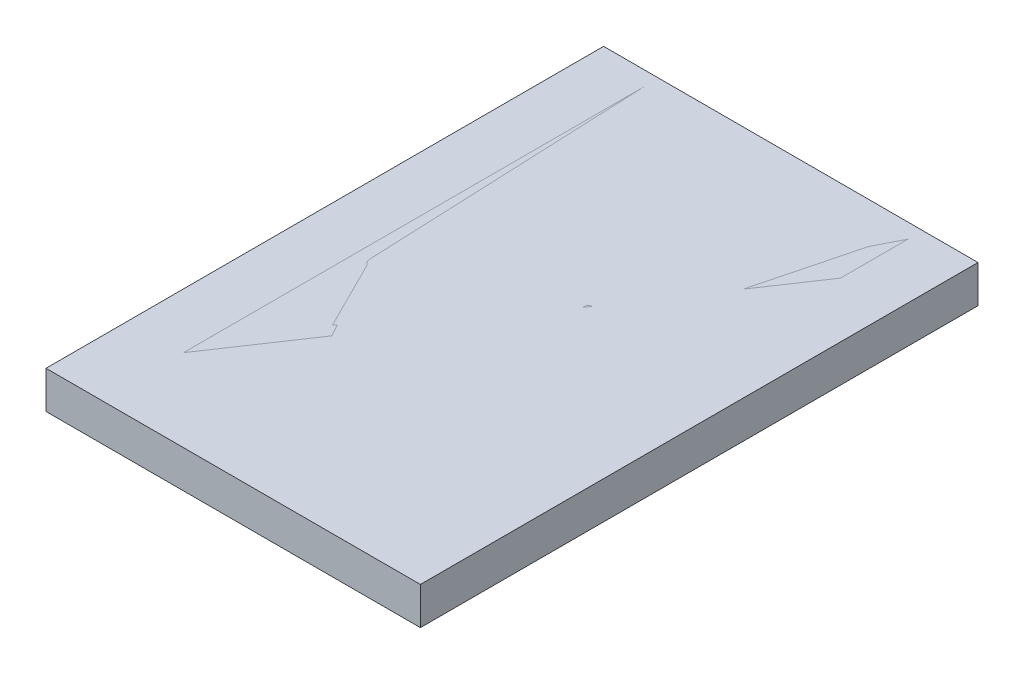
ISO-10303-21;
HEADER;
FILE_DESCRIPTION(('STEP AP214'),'2;1');
FILE_NAME('part.step','',(''),(''),'','','');
FILE_SCHEMA(('AUTOMOTIVE_DESIGN { 1 0 10303 214 1 1 1 1 }'));
ENDSEC;
DATA;
#1=APPLICATION_CONTEXT('core data for automotive mechanical design processes');
#2=APPLICATION_PROTOCOL_DEFINITION('international standard','automotive_design',2000,#1);
#3=PRODUCT_CONTEXT('',#1,'mechanical');
#4=PRODUCT('Part','Part','',(#3));
#5=PRODUCT_RELATED_PRODUCT_CATEGORY('part','',(#4));
#6=PRODUCT_DEFINITION_FORMATION('','',#4);
#7=PRODUCT_DEFINITION_CONTEXT('part definition',#1,'design');
#8=PRODUCT_DEFINITION('design','',#6,#7);
#9=PRODUCT_DEFINITION_SHAPE('','',#8);
#10=(LENGTH_UNIT() NAMED_UNIT(*) SI_UNIT(.MILLI.,.METRE.));
#11=(NAMED_UNIT(*) PLANE_ANGLE_UNIT() SI_UNIT($,.RADIAN.));
#12=(NAMED_UNIT(*) SI_UNIT($,.STERADIAN.) SOLID_ANGLE_UNIT());
#13=UNCERTAINTY_MEASURE_WITH_UNIT(LENGTH_MEASURE(1.E-05),#10,'distance_accuracy_value','');
#14=(GEOMETRIC_REPRESENTATION_CONTEXT(3) GLOBAL_UNCERTAINTY_ASSIGNED_CONTEXT((#13)) GLOBAL_UNIT_ASSIGNED_CONTEXT((#10,
#11,#12)) REPRESENTATION_CONTEXT('',''));
#15=CARTESIAN_POINT('',(0.,0.,0.));
#16=DIRECTION('',(0.,0.,1.));
#17=DIRECTION('',(1.,0.,0.));
#18=AXIS2_PLACEMENT_3D('',#15,#16,#17);
#19=CARTESIAN_POINT('',(68.2,0.,-3.17499999999998));
#20=DIRECTION('',(1.,0.,0.));
#21=DIRECTION('',(0.,0.,-1.));
#22=AXIS2_PLACEMENT_3D('',#19,#20,#21);
#23=PLANE('',#22);
#24=DIRECTION('',(0.,0.,-1.));
#25=VECTOR('',#24,1.);
#26=CARTESIAN_POINT('',(68.2,8.,-3.17499999999998));
#27=LINE('',#26,#25);
#28=CARTESIAN_POINT('',(68.2,8.,115.975));
#29=VERTEX_POINT('',#28);
#30=CARTESIAN_POINT('',(68.2,8.,-3.17499999999998));
#31=VERTEX_POINT('',#30);
#32=EDGE_CURVE('E111',#29,#31,#27,.T.);
#33=ORIENTED_EDGE('',*,*,#32,.F.);
#34=DIRECTION('',(0.,1.,0.));
#35=VECTOR('',#34,1.);
#36=CARTESIAN_POINT('',(68.2,0.,115.975));
#37=LINE('',#36,#35);
#38=CARTESIAN_POINT('',(68.2,0.,115.975));
#39=VERTEX_POINT('',#38);
#40=EDGE_CURVE('E12',#39,#29,#37,.T.);
#41=ORIENTED_EDGE('',*,*,#40,.F.);
#42=DIRECTION('',(0.,0.,-1.));
#43=VECTOR('',#42,1.);
#44=CARTESIAN_POINT('',(68.2,0.,-3.17499999999998));
#45=LINE('',#44,#43);
#46=CARTESIAN_POINT('',(68.2,0.,-3.17499999999998));
#47=VERTEX_POINT('',#46);
#48=EDGE_CURVE('E105',#39,#47,#45,.T.);
#49=ORIENTED_EDGE('',*,*,#48,.T.);
#50=DIRECTION('',(0.,1.,0.));
#51=VECTOR('',#50,1.);
#52=CARTESIAN_POINT('',(68.2,0.,-3.17499999999998));
#53=LINE('',#52,#51);
#54=EDGE_CURVE('E50',#47,#31,#53,.T.);
#55=ORIENTED_EDGE('',*,*,#54,.T.);
#56=EDGE_LOOP('',(#33,#41,#49,#55));
#57=FACE_BOUND('',#56,.T.);
#58=ADVANCED_FACE('F47',(#57),#23,.T.);
#59=CARTESIAN_POINT('',(-11.8,0.,115.975));
#60=DIRECTION('',(0.,0.,1.));
#61=DIRECTION('',(1.,0.,0.));
#62=AXIS2_PLACEMENT_3D('',#59,#60,#61);
#63=PLANE('',#62);
#64=DIRECTION('',(1.,0.,0.));
#65=VECTOR('',#64,1.);
#66=CARTESIAN_POINT('',(-11.8,8.,115.975));
#67=LINE('',#66,#65);
#68=CARTESIAN_POINT('',(-11.8,8.,115.975));
#69=VERTEX_POINT('',#68);
#70=EDGE_CURVE('E107',#69,#29,#67,.T.);
#71=ORIENTED_EDGE('',*,*,#70,.F.);
#72=DIRECTION('',(0.,1.,0.));
#73=VECTOR('',#72,1.);
#74=CARTESIAN_POINT('',(-11.8,0.,115.975));
#75=LINE('',#74,#73);
#76=CARTESIAN_POINT('',(-11.8,0.,115.975));
#77=VERTEX_POINT('',#76);
#78=EDGE_CURVE('E56',#77,#69,#75,.T.);
#79=ORIENTED_EDGE('',*,*,#78,.F.);
#80=DIRECTION('',(1.,0.,0.));
#81=VECTOR('',#80,1.);
#82=CARTESIAN_POINT('',(-11.8,0.,115.975));
#83=LINE('',#82,#81);
#84=EDGE_CURVE('E102',#77,#39,#83,.T.);
#85=ORIENTED_EDGE('',*,*,#84,.T.);
#86=ORIENTED_EDGE('',*,*,#40,.T.);
#87=EDGE_LOOP('',(#71,#79,#85,#86));
#88=FACE_BOUND('',#87,.T.);
#89=ADVANCED_FACE('F121',(#88),#63,.T.);
#90=CARTESIAN_POINT('',(-11.8,0.,-3.17499999999998));
#91=DIRECTION('',(-1.,0.,0.));
#92=DIRECTION('',(0.,0.,1.));
#93=AXIS2_PLACEMENT_3D('',#90,#91,#92);
#94=PLANE('',#93);
#95=DIRECTION('',(0.,0.,1.));
#96=VECTOR('',#95,1.);
#97=CARTESIAN_POINT('',(-11.8,8.,-3.17499999999998));
#98=LINE('',#97,#96);
#99=CARTESIAN_POINT('',(-11.8,8.,-3.17499999999998));
#100=VERTEX_POINT('',#99);
#101=EDGE_CURVE('E97',#100,#69,#98,.T.);
#102=ORIENTED_EDGE('',*,*,#101,.F.);
#103=DIRECTION('',(0.,1.,0.));
#104=VECTOR('',#103,1.);
#105=CARTESIAN_POINT('',(-11.8,0.,-3.17499999999998));
#106=LINE('',#105,#104);
#107=CARTESIAN_POINT('',(-11.8,0.,-3.17499999999998));
#108=VERTEX_POINT('',#107);
#109=EDGE_CURVE('E92',#108,#100,#106,.T.);
#110=ORIENTED_EDGE('',*,*,#109,.F.);
#111=DIRECTION('',(0.,0.,1.));
#112=VECTOR('',#111,1.);
#113=CARTESIAN_POINT('',(-11.8,0.,-3.17499999999998));
#114=LINE('',#113,#112);
#115=EDGE_CURVE('E95',#108,#77,#114,.T.);
#116=ORIENTED_EDGE('',*,*,#115,.T.);
#117=ORIENTED_EDGE('',*,*,#78,.T.);
#118=EDGE_LOOP('',(#102,#110,#116,#117));
#119=FACE_BOUND('',#118,.T.);
#120=ADVANCED_FACE('F94',(#119),#94,.T.);
#121=CARTESIAN_POINT('',(-11.8,0.,-3.17499999999998));
#122=DIRECTION('',(0.,0.,-1.));
#123=DIRECTION('',(-1.,0.,0.));
#124=AXIS2_PLACEMENT_3D('',#121,#122,#123);
#125=PLANE('',#124);
#126=DIRECTION('',(-1.,0.,0.));
#127=VECTOR('',#126,1.);
#128=CARTESIAN_POINT('',(-11.8,8.,-3.17499999999998));
#129=LINE('',#128,#127);
#130=EDGE_CURVE('E114',#31,#100,#129,.T.);
#131=ORIENTED_EDGE('',*,*,#130,.F.);
#132=ORIENTED_EDGE('',*,*,#54,.F.);
#133=DIRECTION('',(-1.,0.,0.));
#134=VECTOR('',#133,1.);
#135=CARTESIAN_POINT('',(-11.8,0.,-3.17499999999998));
#136=LINE('',#135,#134);
#137=EDGE_CURVE('E101',#47,#108,#136,.T.);
#138=ORIENTED_EDGE('',*,*,#137,.T.);
#139=ORIENTED_EDGE('',*,*,#109,.T.);
#140=EDGE_LOOP('',(#131,#132,#138,#139));
#141=FACE_BOUND('',#140,.T.);
#142=ADVANCED_FACE('F104',(#141),#125,.T.);
#143=CARTESIAN_POINT('',(0.,0.,0.));
#144=DIRECTION('',(0.,1.,0.));
#145=DIRECTION('',(0.,0.,1.));
#146=AXIS2_PLACEMENT_3D('',#143,#144,#145);
#147=PLANE('',#146);
#148=ORIENTED_EDGE('',*,*,#48,.F.);
#149=ORIENTED_EDGE('',*,*,#84,.F.);
#150=ORIENTED_EDGE('',*,*,#115,.F.);
#151=ORIENTED_EDGE('',*,*,#137,.F.);
#152=EDGE_LOOP('',(#148,#149,#150,#151));
#153=FACE_BOUND('',#152,.T.);
#154=ADVANCED_FACE('F100',(#153),#147,.F.);
#155=CARTESIAN_POINT('',(0.,8.,0.));
#156=DIRECTION('',(0.,1.,0.));
#157=DIRECTION('',(0.,0.,1.));
#158=AXIS2_PLACEMENT_3D('',#155,#156,#157);
#159=PLANE('',#158);
#160=ORIENTED_EDGE('',*,*,#32,.T.);
#161=ORIENTED_EDGE('',*,*,#130,.T.);
#162=ORIENTED_EDGE('',*,*,#101,.T.);
#163=ORIENTED_EDGE('',*,*,#70,.T.);
#164=EDGE_LOOP('',(#160,#161,#162,#163));
#165=FACE_BOUND('',#164,.T.);
#166=ADVANCED_FACE('F120',(#165),#159,.T.);
#167=CLOSED_SHELL('',(#58,#89,#120,#142,#154,#166));
#168=MANIFOLD_SOLID_BREP('B2_NOT_SHOWN',#167);
#169=CARTESIAN_POINT('',(0.,8.,0.));
#170=DIRECTION('',(0.,1.,0.));
#171=DIRECTION('',(0.,0.,1.));
#172=AXIS2_PLACEMENT_3D('',#169,#170,#171);
#173=PLANE('',#172);
#174=CARTESIAN_POINT('',(51.82,8.,60.98));
#175=DIRECTION('',(0.,-1.,0.));
#176=DIRECTION('',(0.,0.,-1.));
#177=AXIS2_PLACEMENT_3D('',#174,#175,#176);
#178=CIRCLE('',#177,2.);
#179=CARTESIAN_POINT('',(51.82,8.,58.98));
#180=VERTEX_POINT('',#179);
#181=EDGE_CURVE('E277',#180,#180,#178,.T.);
#182=ORIENTED_EDGE('',*,*,#181,.T.);
#183=EDGE_LOOP('',(#182));
#184=FACE_BOUND('',#183,.T.);
#185=CARTESIAN_POINT('',(4.58,8.,108.22));
#186=DIRECTION('',(0.,-1.,0.));
#187=DIRECTION('',(0.,0.,-1.));
#188=AXIS2_PLACEMENT_3D('',#185,#186,#187);
#189=CIRCLE('',#188,2.);
#190=CARTESIAN_POINT('',(4.58,8.,106.22));
#191=VERTEX_POINT('',#190);
#192=EDGE_CURVE('E289',#191,#191,#189,.T.);
#193=ORIENTED_EDGE('',*,*,#192,.T.);
#194=EDGE_LOOP('',(#193));
#195=FACE_BOUND('',#194,.T.);
#196=CARTESIAN_POINT('',(28.2,8.,84.6));
#197=DIRECTION('',(0.,1.,0.));
#198=DIRECTION('',(0.,0.,1.));
#199=AXIS2_PLACEMENT_3D('',#196,#197,#198);
#200=CIRCLE('',#199,14.);
#201=CARTESIAN_POINT('',(28.2,8.,98.6));
#202=VERTEX_POINT('',#201);
#203=EDGE_CURVE('E295',#202,#202,#200,.T.);
#204=ORIENTED_EDGE('',*,*,#203,.F.);
#205=EDGE_LOOP('',(#204));
#206=FACE_BOUND('',#205,.T.);
#207=CARTESIAN_POINT('',(4.58,8.,51.82));
#208=DIRECTION('',(0.,1.,0.));
#209=DIRECTION('',(0.,0.,-1.));
#210=AXIS2_PLACEMENT_3D('',#207,#208,#209);
#211=CIRCLE('',#210,2.);
#212=CARTESIAN_POINT('',(4.58,8.,49.82));
#213=VERTEX_POINT('',#212);
#214=EDGE_CURVE('E301',#213,#213,#211,.T.);
#215=ORIENTED_EDGE('',*,*,#214,.F.);
#216=EDGE_LOOP('',(#215));
#217=FACE_BOUND('',#216,.T.);
#218=CARTESIAN_POINT('',(51.82,8.,51.82));
#219=DIRECTION('',(0.,1.,0.));
#220=DIRECTION('',(0.,0.,1.));
#221=AXIS2_PLACEMENT_3D('',#218,#219,#220);
#222=CIRCLE('',#221,2.);
#223=CARTESIAN_POINT('',(51.82,8.,53.82));
#224=VERTEX_POINT('',#223);
#225=EDGE_CURVE('E307',#224,#224,#222,.T.);
#226=ORIENTED_EDGE('',*,*,#225,.F.);
#227=EDGE_LOOP('',(#226));
#228=FACE_BOUND('',#227,.T.);
#229=CARTESIAN_POINT('',(51.82,8.,4.58));
#230=DIRECTION('',(0.,1.,0.));
#231=DIRECTION('',(0.,0.,-1.));
#232=AXIS2_PLACEMENT_3D('',#229,#230,#231);
#233=CIRCLE('',#232,2.);
#234=CARTESIAN_POINT('',(51.82,8.,2.57999999999999));
#235=VERTEX_POINT('',#234);
#236=EDGE_CURVE('E313',#235,#235,#233,.T.);
#237=ORIENTED_EDGE('',*,*,#236,.F.);
#238=EDGE_LOOP('',(#237));
#239=FACE_BOUND('',#238,.T.);
#240=CARTESIAN_POINT('',(4.58,8.,4.58));
#241=DIRECTION('',(0.,1.,0.));
#242=DIRECTION('',(0.,0.,1.));
#243=AXIS2_PLACEMENT_3D('',#240,#241,#242);
#244=CIRCLE('',#243,2.);
#245=CARTESIAN_POINT('',(4.58,8.,6.58));
#246=VERTEX_POINT('',#245);
#247=EDGE_CURVE('E319',#246,#246,#244,.T.);
#248=ORIENTED_EDGE('',*,*,#247,.F.);
#249=EDGE_LOOP('',(#248));
#250=FACE_BOUND('',#249,.T.);
#251=CARTESIAN_POINT('',(28.2,8.,28.2));
#252=DIRECTION('',(0.,1.,0.));
#253=DIRECTION('',(0.,0.,1.));
#254=AXIS2_PLACEMENT_3D('',#251,#252,#253);
#255=CIRCLE('',#254,19.25);
#256=CARTESIAN_POINT('',(28.2,8.,47.45));
#257=VERTEX_POINT('',#256);
#258=EDGE_CURVE('E331',#257,#257,#255,.T.);
#259=ORIENTED_EDGE('',*,*,#258,.F.);
#260=EDGE_LOOP('',(#259));
#261=FACE_BOUND('',#260,.T.);
#262=DIRECTION('',(0.,0.,1.));
#263=VECTOR('',#262,1.);
#264=CARTESIAN_POINT('',(0.,8.,0.));
#265=LINE('',#264,#263);
#266=CARTESIAN_POINT('',(0.,8.,0.));
#267=VERTEX_POINT('',#266);
#268=CARTESIAN_POINT('',(0.,8.,112.8));
#269=VERTEX_POINT('',#268);
#270=EDGE_CURVE('E340',#267,#269,#265,.T.);
#271=ORIENTED_EDGE('',*,*,#270,.T.);
#272=DIRECTION('',(1.,0.,0.));
#273=VECTOR('',#272,1.);
#274=CARTESIAN_POINT('',(0.,8.,112.8));
#275=LINE('',#274,#273);
#276=CARTESIAN_POINT('',(56.4,8.,112.8));
#277=VERTEX_POINT('',#276);
#278=EDGE_CURVE('E223',#269,#277,#275,.T.);
#279=ORIENTED_EDGE('',*,*,#278,.T.);
#280=DIRECTION('',(0.,0.,-1.));
#281=VECTOR('',#280,1.);
#282=CARTESIAN_POINT('',(56.4,8.,0.));
#283=LINE('',#282,#281);
#284=CARTESIAN_POINT('',(56.4,8.,0.));
#285=VERTEX_POINT('',#284);
#286=EDGE_CURVE('E343',#277,#285,#283,.T.);
#287=ORIENTED_EDGE('',*,*,#286,.T.);
#288=DIRECTION('',(-1.,0.,0.));
#289=VECTOR('',#288,1.);
#290=CARTESIAN_POINT('',(0.,8.,0.));
#291=LINE('',#290,#289);
#292=EDGE_CURVE('E194',#285,#267,#291,.T.);
#293=ORIENTED_EDGE('',*,*,#292,.T.);
#294=EDGE_LOOP('',(#271,#279,#287,#293));
#295=FACE_BOUND('',#294,.T.);
#296=CARTESIAN_POINT('',(51.82,8.,108.22));
#297=DIRECTION('',(0.,-1.,0.));
#298=DIRECTION('',(0.,0.,1.));
#299=AXIS2_PLACEMENT_3D('',#296,#297,#298);
#300=CIRCLE('',#299,2.);
#301=CARTESIAN_POINT('',(51.82,8.,110.22));
#302=VERTEX_POINT('',#301);
#303=EDGE_CURVE('E283',#302,#302,#300,.T.);
#304=ORIENTED_EDGE('',*,*,#303,.T.);
#305=EDGE_LOOP('',(#304));
#306=FACE_BOUND('',#305,.T.);
#307=CARTESIAN_POINT('',(4.58,8.,60.98));
#308=DIRECTION('',(0.,-1.,0.));
#309=DIRECTION('',(0.,0.,1.));
#310=AXIS2_PLACEMENT_3D('',#307,#308,#309);
#311=CIRCLE('',#310,2.);
#312=CARTESIAN_POINT('',(4.58,8.,62.98));
#313=VERTEX_POINT('',#312);
#314=EDGE_CURVE('E272',#313,#313,#311,.T.);
#315=ORIENTED_EDGE('',*,*,#314,.T.);
#316=EDGE_LOOP('',(#315));
#317=FACE_BOUND('',#316,.T.);
#318=ADVANCED_FACE('F170',(#184,#195,#206,#217,#228,#239,#250,#261,#295,#306,#317),#173,.T.);
#319=CARTESIAN_POINT('',(0.,0.,0.));
#320=DIRECTION('',(0.,1.,0.));
#321=DIRECTION('',(0.,0.,1.));
#322=AXIS2_PLACEMENT_3D('',#319,#320,#321);
#323=PLANE('',#322);
#324=CARTESIAN_POINT('',(51.82,0.,60.98));
#325=DIRECTION('',(0.,-1.,0.));
#326=DIRECTION('',(0.,0.,-1.));
#327=AXIS2_PLACEMENT_3D('',#324,#325,#326);
#328=CIRCLE('',#327,2.);
#329=CARTESIAN_POINT('',(51.82,0.,58.98));
#330=VERTEX_POINT('',#329);
#331=EDGE_CURVE('E280',#330,#330,#328,.T.);
#332=ORIENTED_EDGE('',*,*,#331,.F.);
#333=EDGE_LOOP('',(#332));
#334=FACE_BOUND('',#333,.T.);
#335=CARTESIAN_POINT('',(4.58,0.,108.22));
#336=DIRECTION('',(0.,-1.,0.));
#337=DIRECTION('',(0.,0.,-1.));
#338=AXIS2_PLACEMENT_3D('',#335,#336,#337);
#339=CIRCLE('',#338,2.);
#340=CARTESIAN_POINT('',(4.58,0.,106.22));
#341=VERTEX_POINT('',#340);
#342=EDGE_CURVE('E292',#341,#341,#339,.T.);
#343=ORIENTED_EDGE('',*,*,#342,.F.);
#344=EDGE_LOOP('',(#343));
#345=FACE_BOUND('',#344,.T.);
#346=CARTESIAN_POINT('',(28.2,0.,84.6));
#347=DIRECTION('',(0.,1.,0.));
#348=DIRECTION('',(0.,0.,1.));
#349=AXIS2_PLACEMENT_3D('',#346,#347,#348);
#350=CIRCLE('',#349,14.);
#351=CARTESIAN_POINT('',(28.2,0.,98.6));
#352=VERTEX_POINT('',#351);
#353=EDGE_CURVE('E298',#352,#352,#350,.T.);
#354=ORIENTED_EDGE('',*,*,#353,.T.);
#355=EDGE_LOOP('',(#354));
#356=FACE_BOUND('',#355,.T.);
#357=CARTESIAN_POINT('',(4.58,0.,51.82));
#358=DIRECTION('',(0.,1.,0.));
#359=DIRECTION('',(0.,0.,-1.));
#360=AXIS2_PLACEMENT_3D('',#357,#358,#359);
#361=CIRCLE('',#360,2.);
#362=CARTESIAN_POINT('',(4.58,0.,49.82));
#363=VERTEX_POINT('',#362);
#364=EDGE_CURVE('E304',#363,#363,#361,.T.);
#365=ORIENTED_EDGE('',*,*,#364,.T.);
#366=EDGE_LOOP('',(#365));
#367=FACE_BOUND('',#366,.T.);
#368=CARTESIAN_POINT('',(51.82,0.,51.82));
#369=DIRECTION('',(0.,1.,0.));
#370=DIRECTION('',(0.,0.,1.));
#371=AXIS2_PLACEMENT_3D('',#368,#369,#370);
#372=CIRCLE('',#371,2.);
#373=CARTESIAN_POINT('',(51.82,0.,53.82));
#374=VERTEX_POINT('',#373);
#375=EDGE_CURVE('E310',#374,#374,#372,.T.);
#376=ORIENTED_EDGE('',*,*,#375,.T.);
#377=EDGE_LOOP('',(#376));
#378=FACE_BOUND('',#377,.T.);
#379=CARTESIAN_POINT('',(51.82,0.,4.58));
#380=DIRECTION('',(0.,1.,0.));
#381=DIRECTION('',(0.,0.,-1.));
#382=AXIS2_PLACEMENT_3D('',#379,#380,#381);
#383=CIRCLE('',#382,2.);
#384=CARTESIAN_POINT('',(51.82,0.,2.57999999999999));
#385=VERTEX_POINT('',#384);
#386=EDGE_CURVE('E316',#385,#385,#383,.T.);
#387=ORIENTED_EDGE('',*,*,#386,.T.);
#388=EDGE_LOOP('',(#387));
#389=FACE_BOUND('',#388,.T.);
#390=CARTESIAN_POINT('',(4.58,0.,4.58));
#391=DIRECTION('',(0.,1.,0.));
#392=DIRECTION('',(0.,0.,1.));
#393=AXIS2_PLACEMENT_3D('',#390,#391,#392);
#394=CIRCLE('',#393,2.);
#395=CARTESIAN_POINT('',(4.58,0.,6.58));
#396=VERTEX_POINT('',#395);
#397=EDGE_CURVE('E322',#396,#396,#394,.T.);
#398=ORIENTED_EDGE('',*,*,#397,.T.);
#399=EDGE_LOOP('',(#398));
#400=FACE_BOUND('',#399,.T.);
#401=CARTESIAN_POINT('',(28.2,0.,28.2));
#402=DIRECTION('',(0.,1.,0.));
#403=DIRECTION('',(0.,0.,1.));
#404=AXIS2_PLACEMENT_3D('',#401,#402,#403);
#405=CIRCLE('',#404,5.);
#406=CARTESIAN_POINT('',(28.2,0.,33.2));
#407=VERTEX_POINT('',#406);
#408=EDGE_CURVE('E328',#407,#407,#405,.T.);
#409=ORIENTED_EDGE('',*,*,#408,.T.);
#410=EDGE_LOOP('',(#409));
#411=FACE_BOUND('',#410,.T.);
#412=DIRECTION('',(0.,0.,-1.));
#413=VECTOR('',#412,1.);
#414=CARTESIAN_POINT('',(28.2,0.,58.4));
#415=LINE('',#414,#413);
#416=CARTESIAN_POINT('',(28.2,0.,58.4));
#417=VERTEX_POINT('',#416);
#418=CARTESIAN_POINT('',(28.2,0.,54.4));
#419=VERTEX_POINT('',#418);
#420=EDGE_CURVE('E251',#417,#419,#415,.T.);
#421=ORIENTED_EDGE('',*,*,#420,.F.);
#422=DIRECTION('',(-1.,0.,0.));
#423=VECTOR('',#422,1.);
#424=CARTESIAN_POINT('',(28.2,0.,58.4));
#425=LINE('',#424,#423);
#426=CARTESIAN_POINT('',(56.4,0.,58.4));
#427=VERTEX_POINT('',#426);
#428=EDGE_CURVE('E264',#427,#417,#425,.T.);
#429=ORIENTED_EDGE('',*,*,#428,.F.);
#430=DIRECTION('',(0.,0.,-1.));
#431=VECTOR('',#430,1.);
#432=CARTESIAN_POINT('',(56.4,0.,0.));
#433=LINE('',#432,#431);
#434=CARTESIAN_POINT('',(56.4,0.,112.8));
#435=VERTEX_POINT('',#434);
#436=EDGE_CURVE('E352',#435,#427,#433,.T.);
#437=ORIENTED_EDGE('',*,*,#436,.F.);
#438=DIRECTION('',(1.,0.,0.));
#439=VECTOR('',#438,1.);
#440=CARTESIAN_POINT('',(0.,0.,112.8));
#441=LINE('',#440,#439);
#442=CARTESIAN_POINT('',(0.,0.,112.8));
#443=VERTEX_POINT('',#442);
#444=EDGE_CURVE('E349',#443,#435,#441,.T.);
#445=ORIENTED_EDGE('',*,*,#444,.F.);
#446=DIRECTION('',(0.,0.,1.));
#447=VECTOR('',#446,1.);
#448=CARTESIAN_POINT('',(0.,0.,0.));
#449=LINE('',#448,#447);
#450=CARTESIAN_POINT('',(0.,0.,0.));
#451=VERTEX_POINT('',#450);
#452=EDGE_CURVE('E337',#451,#443,#449,.T.);
#453=ORIENTED_EDGE('',*,*,#452,.F.);
#454=DIRECTION('',(-1.,0.,0.));
#455=VECTOR('',#454,1.);
#456=CARTESIAN_POINT('',(0.,0.,0.));
#457=LINE('',#456,#455);
#458=CARTESIAN_POINT('',(56.4,0.,0.));
#459=VERTEX_POINT('',#458);
#460=EDGE_CURVE('E215',#459,#451,#457,.T.);
#461=ORIENTED_EDGE('',*,*,#460,.F.);
#462=CARTESIAN_POINT('',(56.4,0.,54.4));
#463=VERTEX_POINT('',#462);
#464=EDGE_CURVE('E351',#463,#459,#433,.T.);
#465=ORIENTED_EDGE('',*,*,#464,.F.);
#466=DIRECTION('',(1.,0.,0.));
#467=VECTOR('',#466,1.);
#468=CARTESIAN_POINT('',(28.2,0.,54.4));
#469=LINE('',#468,#467);
#470=EDGE_CURVE('E266',#419,#463,#469,.T.);
#471=ORIENTED_EDGE('',*,*,#470,.F.);
#472=EDGE_LOOP('',(#421,#429,#437,#445,#453,#461,#465,#471));
#473=FACE_BOUND('',#472,.T.);
#474=CARTESIAN_POINT('',(51.82,0.,108.22));
#475=DIRECTION('',(0.,-1.,0.));
#476=DIRECTION('',(0.,0.,1.));
#477=AXIS2_PLACEMENT_3D('',#474,#475,#476);
#478=CIRCLE('',#477,2.);
#479=CARTESIAN_POINT('',(51.82,0.,110.22));
#480=VERTEX_POINT('',#479);
#481=EDGE_CURVE('E286',#480,#480,#478,.T.);
#482=ORIENTED_EDGE('',*,*,#481,.F.);
#483=EDGE_LOOP('',(#482));
#484=FACE_BOUND('',#483,.T.);
#485=CARTESIAN_POINT('',(4.58,0.,60.98));
#486=DIRECTION('',(0.,-1.,0.));
#487=DIRECTION('',(0.,0.,1.));
#488=AXIS2_PLACEMENT_3D('',#485,#486,#487);
#489=CIRCLE('',#488,2.);
#490=CARTESIAN_POINT('',(4.58,0.,62.98));
#491=VERTEX_POINT('',#490);
#492=EDGE_CURVE('E274',#491,#491,#489,.T.);
#493=ORIENTED_EDGE('',*,*,#492,.F.);
#494=EDGE_LOOP('',(#493));
#495=FACE_BOUND('',#494,.T.);
#496=ADVANCED_FACE('F370',(#334,#345,#356,#367,#378,#389,#400,#411,#473,#484,#495),#323,.F.);
#497=CARTESIAN_POINT('',(0.,8.,0.));
#498=DIRECTION('',(1.,0.,0.));
#499=DIRECTION('',(0.,0.,-1.));
#500=AXIS2_PLACEMENT_3D('',#497,#498,#499);
#501=PLANE('',#500);
#502=ORIENTED_EDGE('',*,*,#452,.T.);
#503=DIRECTION('',(0.,-1.,0.));
#504=VECTOR('',#503,1.);
#505=CARTESIAN_POINT('',(0.,8.,112.8));
#506=LINE('',#505,#504);
#507=EDGE_CURVE('E362',#269,#443,#506,.T.);
#508=ORIENTED_EDGE('',*,*,#507,.F.);
#509=ORIENTED_EDGE('',*,*,#270,.F.);
#510=DIRECTION('',(0.,-1.,0.));
#511=VECTOR('',#510,1.);
#512=CARTESIAN_POINT('',(0.,8.,0.));
#513=LINE('',#512,#511);
#514=EDGE_CURVE('E346',#267,#451,#513,.T.);
#515=ORIENTED_EDGE('',*,*,#514,.T.);
#516=EDGE_LOOP('',(#502,#508,#509,#515));
#517=FACE_BOUND('',#516,.T.);
#518=ADVANCED_FACE('F172',(#517),#501,.F.);
#519=CARTESIAN_POINT('',(0.,8.,112.8));
#520=DIRECTION('',(0.,0.,-1.));
#521=DIRECTION('',(-1.,0.,0.));
#522=AXIS2_PLACEMENT_3D('',#519,#520,#521);
#523=PLANE('',#522);
#524=ORIENTED_EDGE('',*,*,#444,.T.);
#525=DIRECTION('',(0.,-1.,0.));
#526=VECTOR('',#525,1.);
#527=CARTESIAN_POINT('',(56.4,8.,112.8));
#528=LINE('',#527,#526);
#529=EDGE_CURVE('E359',#277,#435,#528,.T.);
#530=ORIENTED_EDGE('',*,*,#529,.F.);
#531=ORIENTED_EDGE('',*,*,#278,.F.);
#532=ORIENTED_EDGE('',*,*,#507,.T.);
#533=EDGE_LOOP('',(#524,#530,#531,#532));
#534=FACE_BOUND('',#533,.T.);
#535=ADVANCED_FACE('F380',(#534),#523,.F.);
#536=CARTESIAN_POINT('',(56.4,8.,0.));
#537=DIRECTION('',(-1.,0.,0.));
#538=DIRECTION('',(0.,0.,1.));
#539=AXIS2_PLACEMENT_3D('',#536,#537,#538);
#540=PLANE('',#539);
#541=ORIENTED_EDGE('',*,*,#436,.T.);
#542=DIRECTION('',(0.,1.,0.));
#543=VECTOR('',#542,1.);
#544=CARTESIAN_POINT('',(56.4,8.,58.4));
#545=LINE('',#544,#543);
#546=CARTESIAN_POINT('',(56.4,3.,58.4));
#547=VERTEX_POINT('',#546);
#548=EDGE_CURVE('E45',#427,#547,#545,.T.);
#549=ORIENTED_EDGE('',*,*,#548,.T.);
#550=DIRECTION('',(0.,0.,1.));
#551=VECTOR('',#550,1.);
#552=CARTESIAN_POINT('',(56.4,3.,0.));
#553=LINE('',#552,#551);
#554=CARTESIAN_POINT('',(56.4,3.,54.4));
#555=VERTEX_POINT('',#554);
#556=EDGE_CURVE('E364',#555,#547,#553,.T.);
#557=ORIENTED_EDGE('',*,*,#556,.F.);
#558=DIRECTION('',(0.,-1.,0.));
#559=VECTOR('',#558,1.);
#560=CARTESIAN_POINT('',(56.4,8.,54.4));
#561=LINE('',#560,#559);
#562=EDGE_CURVE('E178',#555,#463,#561,.T.);
#563=ORIENTED_EDGE('',*,*,#562,.T.);
#564=ORIENTED_EDGE('',*,*,#464,.T.);
#565=DIRECTION('',(0.,-1.,0.));
#566=VECTOR('',#565,1.);
#567=CARTESIAN_POINT('',(56.4,8.,0.));
#568=LINE('',#567,#566);
#569=EDGE_CURVE('E357',#285,#459,#568,.T.);
#570=ORIENTED_EDGE('',*,*,#569,.F.);
#571=ORIENTED_EDGE('',*,*,#286,.F.);
#572=ORIENTED_EDGE('',*,*,#529,.T.);
#573=EDGE_LOOP('',(#541,#549,#557,#563,#564,#570,#571,#572));
#574=FACE_BOUND('',#573,.T.);
#575=ADVANCED_FACE('F367',(#574),#540,.F.);
#576=CARTESIAN_POINT('',(0.,8.,0.));
#577=DIRECTION('',(0.,0.,1.));
#578=DIRECTION('',(1.,0.,0.));
#579=AXIS2_PLACEMENT_3D('',#576,#577,#578);
#580=PLANE('',#579);
#581=ORIENTED_EDGE('',*,*,#460,.T.);
#582=ORIENTED_EDGE('',*,*,#514,.F.);
#583=ORIENTED_EDGE('',*,*,#292,.F.);
#584=ORIENTED_EDGE('',*,*,#569,.T.);
#585=EDGE_LOOP('',(#581,#582,#583,#584));
#586=FACE_BOUND('',#585,.T.);
#587=ADVANCED_FACE('F377',(#586),#580,.F.);
#588=CARTESIAN_POINT('',(28.2,6.,28.2));
#589=DIRECTION('',(0.,1.,0.));
#590=DIRECTION('',(0.,0.,1.));
#591=AXIS2_PLACEMENT_3D('',#588,#589,#590);
#592=CYLINDRICAL_SURFACE('',#591,19.25);
#593=CARTESIAN_POINT('',(28.2,6.,28.2));
#594=DIRECTION('',(0.,1.,0.));
#595=DIRECTION('',(0.,0.,1.));
#596=AXIS2_PLACEMENT_3D('',#593,#594,#595);
#597=CIRCLE('',#596,19.25);
#598=CARTESIAN_POINT('',(28.2,6.,47.45));
#599=VERTEX_POINT('',#598);
#600=EDGE_CURVE('E334',#599,#599,#597,.T.);
#601=ORIENTED_EDGE('',*,*,#600,.F.);
#602=EDGE_LOOP('',(#601));
#603=FACE_BOUND('',#602,.T.);
#604=ORIENTED_EDGE('',*,*,#258,.T.);
#605=EDGE_LOOP('',(#604));
#606=FACE_BOUND('',#605,.T.);
#607=ADVANCED_FACE('F397',(#603,#606),#592,.F.);
#608=CARTESIAN_POINT('',(28.2,6.,28.2));
#609=DIRECTION('',(0.,1.,0.));
#610=DIRECTION('',(0.,0.,1.));
#611=AXIS2_PLACEMENT_3D('',#608,#609,#610);
#612=PLANE('',#611);
#613=CARTESIAN_POINT('',(28.2,6.,28.2));
#614=DIRECTION('',(0.,1.,0.));
#615=DIRECTION('',(0.,0.,1.));
#616=AXIS2_PLACEMENT_3D('',#613,#614,#615);
#617=CIRCLE('',#616,5.);
#618=CARTESIAN_POINT('',(28.2,6.,33.2));
#619=VERTEX_POINT('',#618);
#620=EDGE_CURVE('E325',#619,#619,#617,.T.);
#621=ORIENTED_EDGE('',*,*,#620,.F.);
#622=EDGE_LOOP('',(#621));
#623=FACE_BOUND('',#622,.T.);
#624=ORIENTED_EDGE('',*,*,#600,.T.);
#625=EDGE_LOOP('',(#624));
#626=FACE_BOUND('',#625,.T.);
#627=ADVANCED_FACE('F404',(#623,#626),#612,.T.);
#628=CARTESIAN_POINT('',(28.2,0.,28.2));
#629=DIRECTION('',(0.,1.,0.));
#630=DIRECTION('',(0.,0.,1.));
#631=AXIS2_PLACEMENT_3D('',#628,#629,#630);
#632=CYLINDRICAL_SURFACE('',#631,5.);
#633=ORIENTED_EDGE('',*,*,#408,.F.);
#634=EDGE_LOOP('',(#633));
#635=FACE_BOUND('',#634,.T.);
#636=ORIENTED_EDGE('',*,*,#620,.T.);
#637=EDGE_LOOP('',(#636));
#638=FACE_BOUND('',#637,.T.);
#639=ADVANCED_FACE('F409',(#635,#638),#632,.F.);
#640=CARTESIAN_POINT('',(4.58,0.,4.58));
#641=DIRECTION('',(0.,1.,0.));
#642=DIRECTION('',(0.,0.,1.));
#643=AXIS2_PLACEMENT_3D('',#640,#641,#642);
#644=CYLINDRICAL_SURFACE('',#643,2.);
#645=ORIENTED_EDGE('',*,*,#397,.F.);
#646=EDGE_LOOP('',(#645));
#647=FACE_BOUND('',#646,.T.);
#648=ORIENTED_EDGE('',*,*,#247,.T.);
#649=EDGE_LOOP('',(#648));
#650=FACE_BOUND('',#649,.T.);
#651=ADVANCED_FACE('F419',(#647,#650),#644,.F.);
#652=CARTESIAN_POINT('',(51.82,0.,4.58));
#653=DIRECTION('',(0.,1.,0.));
#654=DIRECTION('',(0.,0.,1.));
#655=AXIS2_PLACEMENT_3D('',#652,#653,#654);
#656=CYLINDRICAL_SURFACE('',#655,2.);
#657=ORIENTED_EDGE('',*,*,#386,.F.);
#658=EDGE_LOOP('',(#657));
#659=FACE_BOUND('',#658,.T.);
#660=ORIENTED_EDGE('',*,*,#236,.T.);
#661=EDGE_LOOP('',(#660));
#662=FACE_BOUND('',#661,.T.);
#663=ADVANCED_FACE('F426',(#659,#662),#656,.F.);
#664=CARTESIAN_POINT('',(51.82,0.,51.82));
#665=DIRECTION('',(0.,1.,0.));
#666=DIRECTION('',(0.,0.,1.));
#667=AXIS2_PLACEMENT_3D('',#664,#665,#666);
#668=CYLINDRICAL_SURFACE('',#667,2.);
#669=ORIENTED_EDGE('',*,*,#375,.F.);
#670=EDGE_LOOP('',(#669));
#671=FACE_BOUND('',#670,.T.);
#672=ORIENTED_EDGE('',*,*,#225,.T.);
#673=EDGE_LOOP('',(#672));
#674=FACE_BOUND('',#673,.T.);
#675=ADVANCED_FACE('F430',(#671,#674),#668,.F.);
#676=CARTESIAN_POINT('',(4.58,0.,51.82));
#677=DIRECTION('',(0.,1.,0.));
#678=DIRECTION('',(0.,0.,1.));
#679=AXIS2_PLACEMENT_3D('',#676,#677,#678);
#680=CYLINDRICAL_SURFACE('',#679,2.);
#681=ORIENTED_EDGE('',*,*,#364,.F.);
#682=EDGE_LOOP('',(#681));
#683=FACE_BOUND('',#682,.T.);
#684=ORIENTED_EDGE('',*,*,#214,.T.);
#685=EDGE_LOOP('',(#684));
#686=FACE_BOUND('',#685,.T.);
#687=ADVANCED_FACE('F434',(#683,#686),#680,.F.);
#688=CARTESIAN_POINT('',(28.2,0.,84.6));
#689=DIRECTION('',(0.,1.,0.));
#690=DIRECTION('',(0.,0.,1.));
#691=AXIS2_PLACEMENT_3D('',#688,#689,#690);
#692=CYLINDRICAL_SURFACE('',#691,14.);
#693=ORIENTED_EDGE('',*,*,#353,.F.);
#694=EDGE_LOOP('',(#693));
#695=FACE_BOUND('',#694,.T.);
#696=ORIENTED_EDGE('',*,*,#203,.T.);
#697=EDGE_LOOP('',(#696));
#698=FACE_BOUND('',#697,.T.);
#699=ADVANCED_FACE('F438',(#695,#698),#692,.F.);
#700=CARTESIAN_POINT('',(4.58,0.,108.22));
#701=DIRECTION('',(0.,1.,0.));
#702=DIRECTION('',(0.,0.,1.));
#703=AXIS2_PLACEMENT_3D('',#700,#701,#702);
#704=CYLINDRICAL_SURFACE('',#703,2.);
#705=ORIENTED_EDGE('',*,*,#342,.T.);
#706=EDGE_LOOP('',(#705));
#707=FACE_BOUND('',#706,.T.);
#708=ORIENTED_EDGE('',*,*,#192,.F.);
#709=EDGE_LOOP('',(#708));
#710=FACE_BOUND('',#709,.T.);
#711=ADVANCED_FACE('F442',(#707,#710),#704,.F.);
#712=CARTESIAN_POINT('',(51.82,0.,108.22));
#713=DIRECTION('',(0.,1.,0.));
#714=DIRECTION('',(0.,0.,1.));
#715=AXIS2_PLACEMENT_3D('',#712,#713,#714);
#716=CYLINDRICAL_SURFACE('',#715,2.);
#717=ORIENTED_EDGE('',*,*,#481,.T.);
#718=EDGE_LOOP('',(#717));
#719=FACE_BOUND('',#718,.T.);
#720=ORIENTED_EDGE('',*,*,#303,.F.);
#721=EDGE_LOOP('',(#720));
#722=FACE_BOUND('',#721,.T.);
#723=ADVANCED_FACE('F446',(#719,#722),#716,.F.);
#724=CARTESIAN_POINT('',(51.82,0.,60.98));
#725=DIRECTION('',(0.,1.,0.));
#726=DIRECTION('',(0.,0.,1.));
#727=AXIS2_PLACEMENT_3D('',#724,#725,#726);
#728=CYLINDRICAL_SURFACE('',#727,2.);
#729=ORIENTED_EDGE('',*,*,#331,.T.);
#730=EDGE_LOOP('',(#729));
#731=FACE_BOUND('',#730,.T.);
#732=ORIENTED_EDGE('',*,*,#181,.F.);
#733=EDGE_LOOP('',(#732));
#734=FACE_BOUND('',#733,.T.);
#735=ADVANCED_FACE('F450',(#731,#734),#728,.F.);
#736=CARTESIAN_POINT('',(4.58,0.,60.98));
#737=DIRECTION('',(0.,1.,0.));
#738=DIRECTION('',(0.,0.,1.));
#739=AXIS2_PLACEMENT_3D('',#736,#737,#738);
#740=CYLINDRICAL_SURFACE('',#739,2.);
#741=ORIENTED_EDGE('',*,*,#492,.T.);
#742=EDGE_LOOP('',(#741));
#743=FACE_BOUND('',#742,.T.);
#744=ORIENTED_EDGE('',*,*,#314,.F.);
#745=EDGE_LOOP('',(#744));
#746=FACE_BOUND('',#745,.T.);
#747=ADVANCED_FACE('F454',(#743,#746),#740,.F.);
#748=CARTESIAN_POINT('',(28.2,3.,58.4));
#749=DIRECTION('',(0.,0.,1.));
#750=DIRECTION('',(1.,0.,0.));
#751=AXIS2_PLACEMENT_3D('',#748,#749,#750);
#752=PLANE('',#751);
#753=ORIENTED_EDGE('',*,*,#428,.T.);
#754=DIRECTION('',(0.,-1.,0.));
#755=VECTOR('',#754,1.);
#756=CARTESIAN_POINT('',(28.2,3.,58.4));
#757=LINE('',#756,#755);
#758=CARTESIAN_POINT('',(28.2,3.,58.4));
#759=VERTEX_POINT('',#758);
#760=EDGE_CURVE('E254',#759,#417,#757,.T.);
#761=ORIENTED_EDGE('',*,*,#760,.F.);
#762=DIRECTION('',(-1.,0.,0.));
#763=VECTOR('',#762,1.);
#764=CARTESIAN_POINT('',(28.2,3.,58.4));
#765=LINE('',#764,#763);
#766=EDGE_CURVE('E255',#547,#759,#765,.T.);
#767=ORIENTED_EDGE('',*,*,#766,.F.);
#768=ORIENTED_EDGE('',*,*,#548,.F.);
#769=EDGE_LOOP('',(#753,#761,#767,#768));
#770=FACE_BOUND('',#769,.T.);
#771=ADVANCED_FACE('F458',(#770),#752,.F.);
#772=CARTESIAN_POINT('',(28.2,3.,54.4));
#773=DIRECTION('',(0.,0.,-1.));
#774=DIRECTION('',(-1.,0.,0.));
#775=AXIS2_PLACEMENT_3D('',#772,#773,#774);
#776=PLANE('',#775);
#777=DIRECTION('',(1.,0.,0.));
#778=VECTOR('',#777,1.);
#779=CARTESIAN_POINT('',(28.2,3.,54.4));
#780=LINE('',#779,#778);
#781=CARTESIAN_POINT('',(28.2,3.,54.4));
#782=VERTEX_POINT('',#781);
#783=EDGE_CURVE('E185',#782,#555,#780,.T.);
#784=ORIENTED_EDGE('',*,*,#783,.F.);
#785=DIRECTION('',(0.,-1.,0.));
#786=VECTOR('',#785,1.);
#787=CARTESIAN_POINT('',(28.2,3.,54.4));
#788=LINE('',#787,#786);
#789=EDGE_CURVE('E246',#782,#419,#788,.T.);
#790=ORIENTED_EDGE('',*,*,#789,.T.);
#791=ORIENTED_EDGE('',*,*,#470,.T.);
#792=ORIENTED_EDGE('',*,*,#562,.F.);
#793=EDGE_LOOP('',(#784,#790,#791,#792));
#794=FACE_BOUND('',#793,.T.);
#795=ADVANCED_FACE('F257',(#794),#776,.F.);
#796=CARTESIAN_POINT('',(0.,3.,0.));
#797=DIRECTION('',(0.,-1.,0.));
#798=DIRECTION('',(0.,0.,-1.));
#799=AXIS2_PLACEMENT_3D('',#796,#797,#798);
#800=PLANE('',#799);
#801=ORIENTED_EDGE('',*,*,#556,.T.);
#802=ORIENTED_EDGE('',*,*,#766,.T.);
#803=DIRECTION('',(0.,0.,-1.));
#804=VECTOR('',#803,1.);
#805=CARTESIAN_POINT('',(28.2,3.,58.4));
#806=LINE('',#805,#804);
#807=EDGE_CURVE('E249',#759,#782,#806,.T.);
#808=ORIENTED_EDGE('',*,*,#807,.T.);
#809=ORIENTED_EDGE('',*,*,#783,.T.);
#810=EDGE_LOOP('',(#801,#802,#808,#809));
#811=FACE_BOUND('',#810,.T.);
#812=ADVANCED_FACE('F261',(#811),#800,.T.);
#813=CARTESIAN_POINT('',(28.2,3.,58.4));
#814=DIRECTION('',(-1.,0.,0.));
#815=DIRECTION('',(0.,0.,1.));
#816=AXIS2_PLACEMENT_3D('',#813,#814,#815);
#817=PLANE('',#816);
#818=ORIENTED_EDGE('',*,*,#420,.T.);
#819=ORIENTED_EDGE('',*,*,#789,.F.);
#820=ORIENTED_EDGE('',*,*,#807,.F.);
#821=ORIENTED_EDGE('',*,*,#760,.T.);
#822=EDGE_LOOP('',(#818,#819,#820,#821));
#823=FACE_BOUND('',#822,.T.);
#824=ADVANCED_FACE('F247',(#823),#817,.F.);
#825=CLOSED_SHELL('',(#318,#496,#518,#535,#575,#587,#607,#627,#639,#651,#663,#675,#687,#699,
#711,#723,#735,#747,#771,#795,#812,#824));
#826=MANIFOLD_SOLID_BREP('B6',#825);
#827=ADVANCED_BREP_SHAPE_REPRESENTATION('',(#18,#168,#826),#14);
#828=SHAPE_DEFINITION_REPRESENTATION(#9,#827);
ENDSEC;
END-ISO-10303-21;
